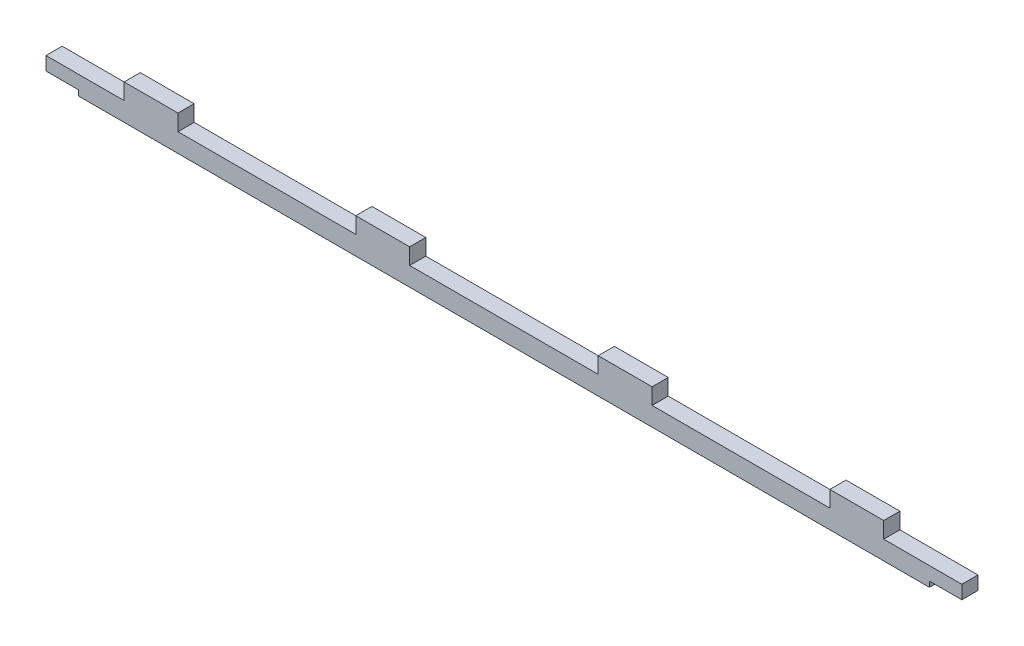
ISO-10303-21;
HEADER;
FILE_DESCRIPTION(('STEP AP214'),'2;1');
FILE_NAME('part.step','',(''),(''),'','','');
FILE_SCHEMA(('AUTOMOTIVE_DESIGN { 1 0 10303 214 1 1 1 1 }'));
ENDSEC;
DATA;
#1=APPLICATION_CONTEXT('core data for automotive mechanical design processes');
#2=APPLICATION_PROTOCOL_DEFINITION('international standard','automotive_design',2000,#1);
#3=PRODUCT_CONTEXT('',#1,'mechanical');
#4=PRODUCT('Part','Part','',(#3));
#5=PRODUCT_RELATED_PRODUCT_CATEGORY('part','',(#4));
#6=PRODUCT_DEFINITION_FORMATION('','',#4);
#7=PRODUCT_DEFINITION_CONTEXT('part definition',#1,'design');
#8=PRODUCT_DEFINITION('design','',#6,#7);
#9=PRODUCT_DEFINITION_SHAPE('','',#8);
#10=(LENGTH_UNIT() NAMED_UNIT(*) SI_UNIT(.MILLI.,.METRE.));
#11=(NAMED_UNIT(*) PLANE_ANGLE_UNIT() SI_UNIT($,.RADIAN.));
#12=(NAMED_UNIT(*) SI_UNIT($,.STERADIAN.) SOLID_ANGLE_UNIT());
#13=UNCERTAINTY_MEASURE_WITH_UNIT(LENGTH_MEASURE(1.E-05),#10,'distance_accuracy_value','');
#14=(GEOMETRIC_REPRESENTATION_CONTEXT(3) GLOBAL_UNCERTAINTY_ASSIGNED_CONTEXT((#13)) GLOBAL_UNIT_ASSIGNED_CONTEXT((#10,
#11,#12)) REPRESENTATION_CONTEXT('',''));
#15=CARTESIAN_POINT('',(0.,0.,0.));
#16=DIRECTION('',(0.,0.,1.));
#17=DIRECTION('',(1.,0.,0.));
#18=AXIS2_PLACEMENT_3D('',#15,#16,#17);
#19=CARTESIAN_POINT('',(70.5,3.50000000000002,3.));
#20=DIRECTION('',(0.,-1.,0.));
#21=DIRECTION('',(1.,0.,0.));
#22=AXIS2_PLACEMENT_3D('',#19,#20,#21);
#23=PLANE('',#22);
#24=DIRECTION('',(-1.,0.,0.));
#25=VECTOR('',#24,1.);
#26=CARTESIAN_POINT('',(70.5,3.50000000000002,0.));
#27=LINE('',#26,#25);
#28=CARTESIAN_POINT('',(85.,3.49999999999998,0.));
#29=VERTEX_POINT('',#28);
#30=CARTESIAN_POINT('',(70.5,3.50000000000002,0.));
#31=VERTEX_POINT('',#30);
#32=EDGE_CURVE('E226',#29,#31,#27,.T.);
#33=ORIENTED_EDGE('',*,*,#32,.T.);
#34=DIRECTION('',(0.,0.,-1.));
#35=VECTOR('',#34,1.);
#36=CARTESIAN_POINT('',(70.5,3.50000000000002,3.));
#37=LINE('',#36,#35);
#38=CARTESIAN_POINT('',(70.5,3.50000000000002,3.));
#39=VERTEX_POINT('',#38);
#40=EDGE_CURVE('E11',#39,#31,#37,.T.);
#41=ORIENTED_EDGE('',*,*,#40,.F.);
#42=DIRECTION('',(-1.,0.,0.));
#43=VECTOR('',#42,1.);
#44=CARTESIAN_POINT('',(70.5,3.50000000000002,3.));
#45=LINE('',#44,#43);
#46=CARTESIAN_POINT('',(85.,3.49999999999998,3.));
#47=VERTEX_POINT('',#46);
#48=EDGE_CURVE('E272',#47,#39,#45,.T.);
#49=ORIENTED_EDGE('',*,*,#48,.F.);
#50=DIRECTION('',(0.,0.,-1.));
#51=VECTOR('',#50,1.);
#52=CARTESIAN_POINT('',(85.,3.49999999999998,3.));
#53=LINE('',#52,#51);
#54=EDGE_CURVE('E222',#47,#29,#53,.T.);
#55=ORIENTED_EDGE('',*,*,#54,.T.);
#56=EDGE_LOOP('',(#33,#41,#49,#55));
#57=FACE_BOUND('',#56,.T.);
#58=ADVANCED_FACE('F34',(#57),#23,.F.);
#59=CARTESIAN_POINT('',(70.5,6.50000000000001,3.));
#60=DIRECTION('',(-1.,0.,0.));
#61=DIRECTION('',(0.,0.,1.));
#62=AXIS2_PLACEMENT_3D('',#59,#60,#61);
#63=PLANE('',#62);
#64=DIRECTION('',(0.,1.,0.));
#65=VECTOR('',#64,1.);
#66=CARTESIAN_POINT('',(70.5,6.50000000000001,0.));
#67=LINE('',#66,#65);
#68=CARTESIAN_POINT('',(70.5,6.50000000000001,0.));
#69=VERTEX_POINT('',#68);
#70=EDGE_CURVE('E229',#31,#69,#67,.T.);
#71=ORIENTED_EDGE('',*,*,#70,.T.);
#72=DIRECTION('',(0.,0.,-1.));
#73=VECTOR('',#72,1.);
#74=CARTESIAN_POINT('',(70.5,6.50000000000001,3.));
#75=LINE('',#74,#73);
#76=CARTESIAN_POINT('',(70.5,6.50000000000001,3.));
#77=VERTEX_POINT('',#76);
#78=EDGE_CURVE('E42',#77,#69,#75,.T.);
#79=ORIENTED_EDGE('',*,*,#78,.F.);
#80=DIRECTION('',(0.,1.,0.));
#81=VECTOR('',#80,1.);
#82=CARTESIAN_POINT('',(70.5,6.50000000000001,3.));
#83=LINE('',#82,#81);
#84=EDGE_CURVE('E141',#39,#77,#83,.T.);
#85=ORIENTED_EDGE('',*,*,#84,.F.);
#86=ORIENTED_EDGE('',*,*,#40,.T.);
#87=EDGE_LOOP('',(#71,#79,#85,#86));
#88=FACE_BOUND('',#87,.T.);
#89=ADVANCED_FACE('F410',(#88),#63,.F.);
#90=CARTESIAN_POINT('',(70.5,6.50000000000001,3.));
#91=DIRECTION('',(0.,-1.,0.));
#92=DIRECTION('',(1.,0.,0.));
#93=AXIS2_PLACEMENT_3D('',#90,#91,#92);
#94=PLANE('',#93);
#95=DIRECTION('',(-1.,0.,0.));
#96=VECTOR('',#95,1.);
#97=CARTESIAN_POINT('',(70.5,6.50000000000001,0.));
#98=LINE('',#97,#96);
#99=CARTESIAN_POINT('',(60.5,6.50000000000001,0.));
#100=VERTEX_POINT('',#99);
#101=EDGE_CURVE('E231',#69,#100,#98,.T.);
#102=ORIENTED_EDGE('',*,*,#101,.T.);
#103=DIRECTION('',(0.,0.,-1.));
#104=VECTOR('',#103,1.);
#105=CARTESIAN_POINT('',(60.5,6.50000000000001,3.));
#106=LINE('',#105,#104);
#107=CARTESIAN_POINT('',(60.5,6.50000000000001,3.));
#108=VERTEX_POINT('',#107);
#109=EDGE_CURVE('E327',#108,#100,#106,.T.);
#110=ORIENTED_EDGE('',*,*,#109,.F.);
#111=DIRECTION('',(-1.,0.,0.));
#112=VECTOR('',#111,1.);
#113=CARTESIAN_POINT('',(70.5,6.50000000000001,3.));
#114=LINE('',#113,#112);
#115=EDGE_CURVE('E335',#77,#108,#114,.T.);
#116=ORIENTED_EDGE('',*,*,#115,.F.);
#117=ORIENTED_EDGE('',*,*,#78,.T.);
#118=EDGE_LOOP('',(#102,#110,#116,#117));
#119=FACE_BOUND('',#118,.T.);
#120=ADVANCED_FACE('F333',(#119),#94,.F.);
#121=CARTESIAN_POINT('',(60.5,6.50000000000001,3.));
#122=DIRECTION('',(1.,0.,0.));
#123=DIRECTION('',(0.,1.,0.));
#124=AXIS2_PLACEMENT_3D('',#121,#122,#123);
#125=PLANE('',#124);
#126=DIRECTION('',(0.,-1.,0.));
#127=VECTOR('',#126,1.);
#128=CARTESIAN_POINT('',(60.5,6.50000000000001,0.));
#129=LINE('',#128,#127);
#130=CARTESIAN_POINT('',(60.5,3.50000000000002,0.));
#131=VERTEX_POINT('',#130);
#132=EDGE_CURVE('E233',#100,#131,#129,.T.);
#133=ORIENTED_EDGE('',*,*,#132,.T.);
#134=DIRECTION('',(0.,0.,-1.));
#135=VECTOR('',#134,1.);
#136=CARTESIAN_POINT('',(60.5,3.50000000000002,3.));
#137=LINE('',#136,#135);
#138=CARTESIAN_POINT('',(60.5,3.50000000000002,3.));
#139=VERTEX_POINT('',#138);
#140=EDGE_CURVE('E324',#139,#131,#137,.T.);
#141=ORIENTED_EDGE('',*,*,#140,.F.);
#142=DIRECTION('',(0.,-1.,0.));
#143=VECTOR('',#142,1.);
#144=CARTESIAN_POINT('',(60.5,6.50000000000001,3.));
#145=LINE('',#144,#143);
#146=EDGE_CURVE('E353',#108,#139,#145,.T.);
#147=ORIENTED_EDGE('',*,*,#146,.F.);
#148=ORIENTED_EDGE('',*,*,#109,.T.);
#149=EDGE_LOOP('',(#133,#141,#147,#148));
#150=FACE_BOUND('',#149,.T.);
#151=ADVANCED_FACE('F344',(#150),#125,.F.);
#152=CARTESIAN_POINT('',(27.5,3.50000000000001,3.));
#153=DIRECTION('',(0.,-1.,0.));
#154=DIRECTION('',(1.,0.,0.));
#155=AXIS2_PLACEMENT_3D('',#152,#153,#154);
#156=PLANE('',#155);
#157=DIRECTION('',(-1.,0.,0.));
#158=VECTOR('',#157,1.);
#159=CARTESIAN_POINT('',(27.5,3.50000000000001,0.));
#160=LINE('',#159,#158);
#161=CARTESIAN_POINT('',(27.5,3.50000000000001,0.));
#162=VERTEX_POINT('',#161);
#163=EDGE_CURVE('E235',#131,#162,#160,.T.);
#164=ORIENTED_EDGE('',*,*,#163,.T.);
#165=DIRECTION('',(0.,0.,-1.));
#166=VECTOR('',#165,1.);
#167=CARTESIAN_POINT('',(27.5,3.50000000000001,3.));
#168=LINE('',#167,#166);
#169=CARTESIAN_POINT('',(27.5,3.50000000000001,3.));
#170=VERTEX_POINT('',#169);
#171=EDGE_CURVE('E321',#170,#162,#168,.T.);
#172=ORIENTED_EDGE('',*,*,#171,.F.);
#173=DIRECTION('',(-1.,0.,0.));
#174=VECTOR('',#173,1.);
#175=CARTESIAN_POINT('',(27.5,3.50000000000001,3.));
#176=LINE('',#175,#174);
#177=EDGE_CURVE('E350',#139,#170,#176,.T.);
#178=ORIENTED_EDGE('',*,*,#177,.F.);
#179=ORIENTED_EDGE('',*,*,#140,.T.);
#180=EDGE_LOOP('',(#164,#172,#178,#179));
#181=FACE_BOUND('',#180,.T.);
#182=ADVANCED_FACE('F348',(#181),#156,.F.);
#183=CARTESIAN_POINT('',(27.5,6.50000000000001,3.));
#184=DIRECTION('',(-1.,0.,0.));
#185=DIRECTION('',(0.,0.,1.));
#186=AXIS2_PLACEMENT_3D('',#183,#184,#185);
#187=PLANE('',#186);
#188=DIRECTION('',(0.,1.,0.));
#189=VECTOR('',#188,1.);
#190=CARTESIAN_POINT('',(27.5,6.50000000000001,0.));
#191=LINE('',#190,#189);
#192=CARTESIAN_POINT('',(27.5,6.50000000000001,0.));
#193=VERTEX_POINT('',#192);
#194=EDGE_CURVE('E237',#162,#193,#191,.T.);
#195=ORIENTED_EDGE('',*,*,#194,.T.);
#196=DIRECTION('',(0.,0.,-1.));
#197=VECTOR('',#196,1.);
#198=CARTESIAN_POINT('',(27.5,6.50000000000001,3.));
#199=LINE('',#198,#197);
#200=CARTESIAN_POINT('',(27.5,6.50000000000001,3.));
#201=VERTEX_POINT('',#200);
#202=EDGE_CURVE('E318',#201,#193,#199,.T.);
#203=ORIENTED_EDGE('',*,*,#202,.F.);
#204=DIRECTION('',(0.,1.,0.));
#205=VECTOR('',#204,1.);
#206=CARTESIAN_POINT('',(27.5,6.50000000000001,3.));
#207=LINE('',#206,#205);
#208=EDGE_CURVE('E352',#170,#201,#207,.T.);
#209=ORIENTED_EDGE('',*,*,#208,.F.);
#210=ORIENTED_EDGE('',*,*,#171,.T.);
#211=EDGE_LOOP('',(#195,#203,#209,#210));
#212=FACE_BOUND('',#211,.T.);
#213=ADVANCED_FACE('F423',(#212),#187,.F.);
#214=CARTESIAN_POINT('',(27.5,6.50000000000001,3.));
#215=DIRECTION('',(0.,-1.,0.));
#216=DIRECTION('',(0.,0.,-1.));
#217=AXIS2_PLACEMENT_3D('',#214,#215,#216);
#218=PLANE('',#217);
#219=DIRECTION('',(-1.,0.,0.));
#220=VECTOR('',#219,1.);
#221=CARTESIAN_POINT('',(27.5,6.50000000000001,0.));
#222=LINE('',#221,#220);
#223=CARTESIAN_POINT('',(17.5,6.50000000000001,0.));
#224=VERTEX_POINT('',#223);
#225=EDGE_CURVE('E239',#193,#224,#222,.T.);
#226=ORIENTED_EDGE('',*,*,#225,.T.);
#227=DIRECTION('',(0.,0.,-1.));
#228=VECTOR('',#227,1.);
#229=CARTESIAN_POINT('',(17.5,6.50000000000001,3.));
#230=LINE('',#229,#228);
#231=CARTESIAN_POINT('',(17.5,6.50000000000001,3.));
#232=VERTEX_POINT('',#231);
#233=EDGE_CURVE('E315',#232,#224,#230,.T.);
#234=ORIENTED_EDGE('',*,*,#233,.F.);
#235=DIRECTION('',(-1.,0.,0.));
#236=VECTOR('',#235,1.);
#237=CARTESIAN_POINT('',(27.5,6.50000000000001,3.));
#238=LINE('',#237,#236);
#239=EDGE_CURVE('E355',#201,#232,#238,.T.);
#240=ORIENTED_EDGE('',*,*,#239,.F.);
#241=ORIENTED_EDGE('',*,*,#202,.T.);
#242=EDGE_LOOP('',(#226,#234,#240,#241));
#243=FACE_BOUND('',#242,.T.);
#244=ADVANCED_FACE('F426',(#243),#218,.F.);
#245=CARTESIAN_POINT('',(17.5,6.50000000000001,3.));
#246=DIRECTION('',(1.,0.,0.));
#247=DIRECTION('',(0.,1.,0.));
#248=AXIS2_PLACEMENT_3D('',#245,#246,#247);
#249=PLANE('',#248);
#250=DIRECTION('',(0.,-1.,0.));
#251=VECTOR('',#250,1.);
#252=CARTESIAN_POINT('',(17.5,6.50000000000001,0.));
#253=LINE('',#252,#251);
#254=CARTESIAN_POINT('',(17.5,3.50000000000001,0.));
#255=VERTEX_POINT('',#254);
#256=EDGE_CURVE('E241',#224,#255,#253,.T.);
#257=ORIENTED_EDGE('',*,*,#256,.T.);
#258=DIRECTION('',(0.,0.,-1.));
#259=VECTOR('',#258,1.);
#260=CARTESIAN_POINT('',(17.5,3.50000000000001,3.));
#261=LINE('',#260,#259);
#262=CARTESIAN_POINT('',(17.5,3.50000000000001,3.));
#263=VERTEX_POINT('',#262);
#264=EDGE_CURVE('E312',#263,#255,#261,.T.);
#265=ORIENTED_EDGE('',*,*,#264,.F.);
#266=DIRECTION('',(0.,-1.,0.));
#267=VECTOR('',#266,1.);
#268=CARTESIAN_POINT('',(17.5,6.50000000000001,3.));
#269=LINE('',#268,#267);
#270=EDGE_CURVE('E361',#232,#263,#269,.T.);
#271=ORIENTED_EDGE('',*,*,#270,.F.);
#272=ORIENTED_EDGE('',*,*,#233,.T.);
#273=EDGE_LOOP('',(#257,#265,#271,#272));
#274=FACE_BOUND('',#273,.T.);
#275=ADVANCED_FACE('F430',(#274),#249,.F.);
#276=CARTESIAN_POINT('',(-17.5,3.50000000000001,3.));
#277=DIRECTION('',(0.,-1.,0.));
#278=DIRECTION('',(1.,0.,0.));
#279=AXIS2_PLACEMENT_3D('',#276,#277,#278);
#280=PLANE('',#279);
#281=DIRECTION('',(-1.,0.,0.));
#282=VECTOR('',#281,1.);
#283=CARTESIAN_POINT('',(-17.5,3.50000000000001,0.));
#284=LINE('',#283,#282);
#285=CARTESIAN_POINT('',(-17.5,3.50000000000001,0.));
#286=VERTEX_POINT('',#285);
#287=EDGE_CURVE('E243',#255,#286,#284,.T.);
#288=ORIENTED_EDGE('',*,*,#287,.T.);
#289=DIRECTION('',(0.,0.,-1.));
#290=VECTOR('',#289,1.);
#291=CARTESIAN_POINT('',(-17.5,3.50000000000001,3.));
#292=LINE('',#291,#290);
#293=CARTESIAN_POINT('',(-17.5,3.50000000000001,3.));
#294=VERTEX_POINT('',#293);
#295=EDGE_CURVE('E309',#294,#286,#292,.T.);
#296=ORIENTED_EDGE('',*,*,#295,.F.);
#297=DIRECTION('',(-1.,0.,0.));
#298=VECTOR('',#297,1.);
#299=CARTESIAN_POINT('',(-17.5,3.50000000000001,3.));
#300=LINE('',#299,#298);
#301=EDGE_CURVE('E363',#263,#294,#300,.T.);
#302=ORIENTED_EDGE('',*,*,#301,.F.);
#303=ORIENTED_EDGE('',*,*,#264,.T.);
#304=EDGE_LOOP('',(#288,#296,#302,#303));
#305=FACE_BOUND('',#304,.T.);
#306=ADVANCED_FACE('F434',(#305),#280,.F.);
#307=CARTESIAN_POINT('',(-17.5,6.5,3.));
#308=DIRECTION('',(-1.,0.,0.));
#309=DIRECTION('',(0.,-1.,0.));
#310=AXIS2_PLACEMENT_3D('',#307,#308,#309);
#311=PLANE('',#310);
#312=DIRECTION('',(0.,1.,0.));
#313=VECTOR('',#312,1.);
#314=CARTESIAN_POINT('',(-17.5,6.5,0.));
#315=LINE('',#314,#313);
#316=CARTESIAN_POINT('',(-17.5,6.5,0.));
#317=VERTEX_POINT('',#316);
#318=EDGE_CURVE('E245',#286,#317,#315,.T.);
#319=ORIENTED_EDGE('',*,*,#318,.T.);
#320=DIRECTION('',(0.,0.,-1.));
#321=VECTOR('',#320,1.);
#322=CARTESIAN_POINT('',(-17.5,6.5,3.));
#323=LINE('',#322,#321);
#324=CARTESIAN_POINT('',(-17.5,6.5,3.));
#325=VERTEX_POINT('',#324);
#326=EDGE_CURVE('E306',#325,#317,#323,.T.);
#327=ORIENTED_EDGE('',*,*,#326,.F.);
#328=DIRECTION('',(0.,1.,0.));
#329=VECTOR('',#328,1.);
#330=CARTESIAN_POINT('',(-17.5,6.5,3.));
#331=LINE('',#330,#329);
#332=EDGE_CURVE('E365',#294,#325,#331,.T.);
#333=ORIENTED_EDGE('',*,*,#332,.F.);
#334=ORIENTED_EDGE('',*,*,#295,.T.);
#335=EDGE_LOOP('',(#319,#327,#333,#334));
#336=FACE_BOUND('',#335,.T.);
#337=ADVANCED_FACE('F438',(#336),#311,.F.);
#338=CARTESIAN_POINT('',(-27.5,6.5,3.));
#339=DIRECTION('',(0.,-1.,0.));
#340=DIRECTION('',(1.,0.,0.));
#341=AXIS2_PLACEMENT_3D('',#338,#339,#340);
#342=PLANE('',#341);
#343=DIRECTION('',(-1.,0.,0.));
#344=VECTOR('',#343,1.);
#345=CARTESIAN_POINT('',(-27.5,6.5,0.));
#346=LINE('',#345,#344);
#347=CARTESIAN_POINT('',(-27.5,6.5,0.));
#348=VERTEX_POINT('',#347);
#349=EDGE_CURVE('E247',#317,#348,#346,.T.);
#350=ORIENTED_EDGE('',*,*,#349,.T.);
#351=DIRECTION('',(0.,0.,-1.));
#352=VECTOR('',#351,1.);
#353=CARTESIAN_POINT('',(-27.5,6.5,3.));
#354=LINE('',#353,#352);
#355=CARTESIAN_POINT('',(-27.5,6.5,3.));
#356=VERTEX_POINT('',#355);
#357=EDGE_CURVE('E303',#356,#348,#354,.T.);
#358=ORIENTED_EDGE('',*,*,#357,.F.);
#359=DIRECTION('',(-1.,0.,0.));
#360=VECTOR('',#359,1.);
#361=CARTESIAN_POINT('',(-27.5,6.5,3.));
#362=LINE('',#361,#360);
#363=EDGE_CURVE('E367',#325,#356,#362,.T.);
#364=ORIENTED_EDGE('',*,*,#363,.F.);
#365=ORIENTED_EDGE('',*,*,#326,.T.);
#366=EDGE_LOOP('',(#350,#358,#364,#365));
#367=FACE_BOUND('',#366,.T.);
#368=ADVANCED_FACE('F442',(#367),#342,.F.);
#369=CARTESIAN_POINT('',(-27.5,6.5,3.));
#370=DIRECTION('',(1.,0.,0.));
#371=DIRECTION('',(0.,0.,-1.));
#372=AXIS2_PLACEMENT_3D('',#369,#370,#371);
#373=PLANE('',#372);
#374=DIRECTION('',(0.,-1.,0.));
#375=VECTOR('',#374,1.);
#376=CARTESIAN_POINT('',(-27.5,6.5,0.));
#377=LINE('',#376,#375);
#378=CARTESIAN_POINT('',(-27.5,3.5,0.));
#379=VERTEX_POINT('',#378);
#380=EDGE_CURVE('E249',#348,#379,#377,.T.);
#381=ORIENTED_EDGE('',*,*,#380,.T.);
#382=DIRECTION('',(0.,0.,-1.));
#383=VECTOR('',#382,1.);
#384=CARTESIAN_POINT('',(-27.5,3.5,3.));
#385=LINE('',#384,#383);
#386=CARTESIAN_POINT('',(-27.5,3.5,3.));
#387=VERTEX_POINT('',#386);
#388=EDGE_CURVE('E300',#387,#379,#385,.T.);
#389=ORIENTED_EDGE('',*,*,#388,.F.);
#390=DIRECTION('',(0.,-1.,0.));
#391=VECTOR('',#390,1.);
#392=CARTESIAN_POINT('',(-27.5,6.5,3.));
#393=LINE('',#392,#391);
#394=EDGE_CURVE('E369',#356,#387,#393,.T.);
#395=ORIENTED_EDGE('',*,*,#394,.F.);
#396=ORIENTED_EDGE('',*,*,#357,.T.);
#397=EDGE_LOOP('',(#381,#389,#395,#396));
#398=FACE_BOUND('',#397,.T.);
#399=ADVANCED_FACE('F446',(#398),#373,.F.);
#400=CARTESIAN_POINT('',(-60.5,3.5,3.));
#401=DIRECTION('',(0.,-1.,0.));
#402=DIRECTION('',(0.,0.,-1.));
#403=AXIS2_PLACEMENT_3D('',#400,#401,#402);
#404=PLANE('',#403);
#405=DIRECTION('',(-1.,0.,0.));
#406=VECTOR('',#405,1.);
#407=CARTESIAN_POINT('',(-60.5,3.5,0.));
#408=LINE('',#407,#406);
#409=CARTESIAN_POINT('',(-60.5,3.5,0.));
#410=VERTEX_POINT('',#409);
#411=EDGE_CURVE('E251',#379,#410,#408,.T.);
#412=ORIENTED_EDGE('',*,*,#411,.T.);
#413=DIRECTION('',(0.,0.,-1.));
#414=VECTOR('',#413,1.);
#415=CARTESIAN_POINT('',(-60.5,3.5,3.));
#416=LINE('',#415,#414);
#417=CARTESIAN_POINT('',(-60.5,3.5,3.));
#418=VERTEX_POINT('',#417);
#419=EDGE_CURVE('E297',#418,#410,#416,.T.);
#420=ORIENTED_EDGE('',*,*,#419,.F.);
#421=DIRECTION('',(-1.,0.,0.));
#422=VECTOR('',#421,1.);
#423=CARTESIAN_POINT('',(-60.5,3.5,3.));
#424=LINE('',#423,#422);
#425=EDGE_CURVE('E371',#387,#418,#424,.T.);
#426=ORIENTED_EDGE('',*,*,#425,.F.);
#427=ORIENTED_EDGE('',*,*,#388,.T.);
#428=EDGE_LOOP('',(#412,#420,#426,#427));
#429=FACE_BOUND('',#428,.T.);
#430=ADVANCED_FACE('F450',(#429),#404,.F.);
#431=CARTESIAN_POINT('',(-60.5,6.49999999999999,3.));
#432=DIRECTION('',(-1.,0.,0.));
#433=DIRECTION('',(0.,-1.,0.));
#434=AXIS2_PLACEMENT_3D('',#431,#432,#433);
#435=PLANE('',#434);
#436=DIRECTION('',(0.,1.,0.));
#437=VECTOR('',#436,1.);
#438=CARTESIAN_POINT('',(-60.5,6.49999999999999,0.));
#439=LINE('',#438,#437);
#440=CARTESIAN_POINT('',(-60.5,6.49999999999999,0.));
#441=VERTEX_POINT('',#440);
#442=EDGE_CURVE('E253',#410,#441,#439,.T.);
#443=ORIENTED_EDGE('',*,*,#442,.T.);
#444=DIRECTION('',(0.,0.,-1.));
#445=VECTOR('',#444,1.);
#446=CARTESIAN_POINT('',(-60.5,6.49999999999999,3.));
#447=LINE('',#446,#445);
#448=CARTESIAN_POINT('',(-60.5,6.49999999999999,3.));
#449=VERTEX_POINT('',#448);
#450=EDGE_CURVE('E294',#449,#441,#447,.T.);
#451=ORIENTED_EDGE('',*,*,#450,.F.);
#452=DIRECTION('',(0.,1.,0.));
#453=VECTOR('',#452,1.);
#454=CARTESIAN_POINT('',(-60.5,6.49999999999999,3.));
#455=LINE('',#454,#453);
#456=EDGE_CURVE('E373',#418,#449,#455,.T.);
#457=ORIENTED_EDGE('',*,*,#456,.F.);
#458=ORIENTED_EDGE('',*,*,#419,.T.);
#459=EDGE_LOOP('',(#443,#451,#457,#458));
#460=FACE_BOUND('',#459,.T.);
#461=ADVANCED_FACE('F454',(#460),#435,.F.);
#462=CARTESIAN_POINT('',(-70.5,6.49999999999999,3.));
#463=DIRECTION('',(0.,-1.,0.));
#464=DIRECTION('',(1.,0.,0.));
#465=AXIS2_PLACEMENT_3D('',#462,#463,#464);
#466=PLANE('',#465);
#467=DIRECTION('',(-1.,0.,0.));
#468=VECTOR('',#467,1.);
#469=CARTESIAN_POINT('',(-70.5,6.49999999999999,0.));
#470=LINE('',#469,#468);
#471=CARTESIAN_POINT('',(-70.5,6.49999999999999,0.));
#472=VERTEX_POINT('',#471);
#473=EDGE_CURVE('E255',#441,#472,#470,.T.);
#474=ORIENTED_EDGE('',*,*,#473,.T.);
#475=DIRECTION('',(0.,0.,-1.));
#476=VECTOR('',#475,1.);
#477=CARTESIAN_POINT('',(-70.5,6.49999999999999,3.));
#478=LINE('',#477,#476);
#479=CARTESIAN_POINT('',(-70.5,6.49999999999999,3.));
#480=VERTEX_POINT('',#479);
#481=EDGE_CURVE('E291',#480,#472,#478,.T.);
#482=ORIENTED_EDGE('',*,*,#481,.F.);
#483=DIRECTION('',(-1.,0.,0.));
#484=VECTOR('',#483,1.);
#485=CARTESIAN_POINT('',(-70.5,6.49999999999999,3.));
#486=LINE('',#485,#484);
#487=EDGE_CURVE('E375',#449,#480,#486,.T.);
#488=ORIENTED_EDGE('',*,*,#487,.F.);
#489=ORIENTED_EDGE('',*,*,#450,.T.);
#490=EDGE_LOOP('',(#474,#482,#488,#489));
#491=FACE_BOUND('',#490,.T.);
#492=ADVANCED_FACE('F458',(#491),#466,.F.);
#493=CARTESIAN_POINT('',(-70.5,6.49999999999999,3.));
#494=DIRECTION('',(1.,0.,0.));
#495=DIRECTION('',(0.,0.,-1.));
#496=AXIS2_PLACEMENT_3D('',#493,#494,#495);
#497=PLANE('',#496);
#498=DIRECTION('',(0.,-1.,0.));
#499=VECTOR('',#498,1.);
#500=CARTESIAN_POINT('',(-70.5,6.49999999999999,0.));
#501=LINE('',#500,#499);
#502=CARTESIAN_POINT('',(-70.5,3.5,0.));
#503=VERTEX_POINT('',#502);
#504=EDGE_CURVE('E257',#472,#503,#501,.T.);
#505=ORIENTED_EDGE('',*,*,#504,.T.);
#506=DIRECTION('',(0.,0.,-1.));
#507=VECTOR('',#506,1.);
#508=CARTESIAN_POINT('',(-70.5,3.5,3.));
#509=LINE('',#508,#507);
#510=CARTESIAN_POINT('',(-70.5,3.5,3.));
#511=VERTEX_POINT('',#510);
#512=EDGE_CURVE('E288',#511,#503,#509,.T.);
#513=ORIENTED_EDGE('',*,*,#512,.F.);
#514=DIRECTION('',(0.,-1.,0.));
#515=VECTOR('',#514,1.);
#516=CARTESIAN_POINT('',(-70.5,6.49999999999999,3.));
#517=LINE('',#516,#515);
#518=EDGE_CURVE('E377',#480,#511,#517,.T.);
#519=ORIENTED_EDGE('',*,*,#518,.F.);
#520=ORIENTED_EDGE('',*,*,#481,.T.);
#521=EDGE_LOOP('',(#505,#513,#519,#520));
#522=FACE_BOUND('',#521,.T.);
#523=ADVANCED_FACE('F462',(#522),#497,.F.);
#524=CARTESIAN_POINT('',(-85.,3.5,3.));
#525=DIRECTION('',(0.,-1.,0.));
#526=DIRECTION('',(1.,0.,0.));
#527=AXIS2_PLACEMENT_3D('',#524,#525,#526);
#528=PLANE('',#527);
#529=DIRECTION('',(-1.,0.,0.));
#530=VECTOR('',#529,1.);
#531=CARTESIAN_POINT('',(-85.,3.5,0.));
#532=LINE('',#531,#530);
#533=CARTESIAN_POINT('',(-85.,3.5,0.));
#534=VERTEX_POINT('',#533);
#535=EDGE_CURVE('E259',#503,#534,#532,.T.);
#536=ORIENTED_EDGE('',*,*,#535,.T.);
#537=DIRECTION('',(0.,0.,-1.));
#538=VECTOR('',#537,1.);
#539=CARTESIAN_POINT('',(-85.,3.5,3.));
#540=LINE('',#539,#538);
#541=CARTESIAN_POINT('',(-85.,3.5,3.));
#542=VERTEX_POINT('',#541);
#543=EDGE_CURVE('E285',#542,#534,#540,.T.);
#544=ORIENTED_EDGE('',*,*,#543,.F.);
#545=DIRECTION('',(-1.,0.,0.));
#546=VECTOR('',#545,1.);
#547=CARTESIAN_POINT('',(-85.,3.5,3.));
#548=LINE('',#547,#546);
#549=EDGE_CURVE('E379',#511,#542,#548,.T.);
#550=ORIENTED_EDGE('',*,*,#549,.F.);
#551=ORIENTED_EDGE('',*,*,#512,.T.);
#552=EDGE_LOOP('',(#536,#544,#550,#551));
#553=FACE_BOUND('',#552,.T.);
#554=ADVANCED_FACE('F466',(#553),#528,.F.);
#555=CARTESIAN_POINT('',(-85.,1.,3.));
#556=DIRECTION('',(1.,0.,0.));
#557=DIRECTION('',(0.,0.,-1.));
#558=AXIS2_PLACEMENT_3D('',#555,#556,#557);
#559=PLANE('',#558);
#560=DIRECTION('',(0.,-1.,0.));
#561=VECTOR('',#560,1.);
#562=CARTESIAN_POINT('',(-85.,1.,0.));
#563=LINE('',#562,#561);
#564=CARTESIAN_POINT('',(-85.,1.,0.));
#565=VERTEX_POINT('',#564);
#566=EDGE_CURVE('E261',#534,#565,#563,.T.);
#567=ORIENTED_EDGE('',*,*,#566,.T.);
#568=DIRECTION('',(0.,0.,-1.));
#569=VECTOR('',#568,1.);
#570=CARTESIAN_POINT('',(-85.,1.,3.));
#571=LINE('',#570,#569);
#572=CARTESIAN_POINT('',(-85.,1.,3.));
#573=VERTEX_POINT('',#572);
#574=EDGE_CURVE('E282',#573,#565,#571,.T.);
#575=ORIENTED_EDGE('',*,*,#574,.F.);
#576=DIRECTION('',(0.,-1.,0.));
#577=VECTOR('',#576,1.);
#578=CARTESIAN_POINT('',(-85.,1.,3.));
#579=LINE('',#578,#577);
#580=EDGE_CURVE('E381',#542,#573,#579,.T.);
#581=ORIENTED_EDGE('',*,*,#580,.F.);
#582=ORIENTED_EDGE('',*,*,#543,.T.);
#583=EDGE_LOOP('',(#567,#575,#581,#582));
#584=FACE_BOUND('',#583,.T.);
#585=ADVANCED_FACE('F470',(#584),#559,.F.);
#586=CARTESIAN_POINT('',(-85.,1.,3.));
#587=DIRECTION('',(0.,1.,0.));
#588=DIRECTION('',(0.,0.,1.));
#589=AXIS2_PLACEMENT_3D('',#586,#587,#588);
#590=PLANE('',#589);
#591=DIRECTION('',(1.,0.,0.));
#592=VECTOR('',#591,1.);
#593=CARTESIAN_POINT('',(-85.,1.,0.));
#594=LINE('',#593,#592);
#595=CARTESIAN_POINT('',(-79.,1.,0.));
#596=VERTEX_POINT('',#595);
#597=EDGE_CURVE('E263',#565,#596,#594,.T.);
#598=ORIENTED_EDGE('',*,*,#597,.T.);
#599=DIRECTION('',(0.,0.,-1.));
#600=VECTOR('',#599,1.);
#601=CARTESIAN_POINT('',(-79.,1.,3.));
#602=LINE('',#601,#600);
#603=CARTESIAN_POINT('',(-79.,1.,3.));
#604=VERTEX_POINT('',#603);
#605=EDGE_CURVE('E279',#604,#596,#602,.T.);
#606=ORIENTED_EDGE('',*,*,#605,.F.);
#607=DIRECTION('',(1.,0.,0.));
#608=VECTOR('',#607,1.);
#609=CARTESIAN_POINT('',(-85.,1.,3.));
#610=LINE('',#609,#608);
#611=EDGE_CURVE('E383',#573,#604,#610,.T.);
#612=ORIENTED_EDGE('',*,*,#611,.F.);
#613=ORIENTED_EDGE('',*,*,#574,.T.);
#614=EDGE_LOOP('',(#598,#606,#612,#613));
#615=FACE_BOUND('',#614,.T.);
#616=ADVANCED_FACE('F474',(#615),#590,.F.);
#617=CARTESIAN_POINT('',(-79.,1.,3.));
#618=DIRECTION('',(1.,0.,0.));
#619=DIRECTION('',(0.,0.,-1.));
#620=AXIS2_PLACEMENT_3D('',#617,#618,#619);
#621=PLANE('',#620);
#622=DIRECTION('',(0.,-1.,0.));
#623=VECTOR('',#622,1.);
#624=CARTESIAN_POINT('',(-79.,1.,0.));
#625=LINE('',#624,#623);
#626=CARTESIAN_POINT('',(-79.,0.,0.));
#627=VERTEX_POINT('',#626);
#628=EDGE_CURVE('E265',#596,#627,#625,.T.);
#629=ORIENTED_EDGE('',*,*,#628,.T.);
#630=DIRECTION('',(0.,0.,-1.));
#631=VECTOR('',#630,1.);
#632=CARTESIAN_POINT('',(-79.,0.,3.));
#633=LINE('',#632,#631);
#634=CARTESIAN_POINT('',(-79.,0.,3.));
#635=VERTEX_POINT('',#634);
#636=EDGE_CURVE('E276',#635,#627,#633,.T.);
#637=ORIENTED_EDGE('',*,*,#636,.F.);
#638=DIRECTION('',(0.,-1.,0.));
#639=VECTOR('',#638,1.);
#640=CARTESIAN_POINT('',(-79.,1.,3.));
#641=LINE('',#640,#639);
#642=EDGE_CURVE('E385',#604,#635,#641,.T.);
#643=ORIENTED_EDGE('',*,*,#642,.F.);
#644=ORIENTED_EDGE('',*,*,#605,.T.);
#645=EDGE_LOOP('',(#629,#637,#643,#644));
#646=FACE_BOUND('',#645,.T.);
#647=ADVANCED_FACE('F391',(#646),#621,.F.);
#648=CARTESIAN_POINT('',(-79.,0.,3.));
#649=DIRECTION('',(0.,1.,0.));
#650=DIRECTION('',(-1.,0.,0.));
#651=AXIS2_PLACEMENT_3D('',#648,#649,#650);
#652=PLANE('',#651);
#653=DIRECTION('',(1.,0.,0.));
#654=VECTOR('',#653,1.);
#655=CARTESIAN_POINT('',(-79.,0.,0.));
#656=LINE('',#655,#654);
#657=CARTESIAN_POINT('',(79.,0.,0.));
#658=VERTEX_POINT('',#657);
#659=EDGE_CURVE('E267',#627,#658,#656,.T.);
#660=ORIENTED_EDGE('',*,*,#659,.T.);
#661=DIRECTION('',(0.,0.,-1.));
#662=VECTOR('',#661,1.);
#663=CARTESIAN_POINT('',(79.,0.,3.));
#664=LINE('',#663,#662);
#665=CARTESIAN_POINT('',(79.,0.,3.));
#666=VERTEX_POINT('',#665);
#667=EDGE_CURVE('E217',#666,#658,#664,.T.);
#668=ORIENTED_EDGE('',*,*,#667,.F.);
#669=DIRECTION('',(1.,0.,0.));
#670=VECTOR('',#669,1.);
#671=CARTESIAN_POINT('',(-79.,0.,3.));
#672=LINE('',#671,#670);
#673=EDGE_CURVE('E208',#635,#666,#672,.T.);
#674=ORIENTED_EDGE('',*,*,#673,.F.);
#675=ORIENTED_EDGE('',*,*,#636,.T.);
#676=EDGE_LOOP('',(#660,#668,#674,#675));
#677=FACE_BOUND('',#676,.T.);
#678=ADVANCED_FACE('F395',(#677),#652,.F.);
#679=CARTESIAN_POINT('',(79.,1.00000000000002,3.));
#680=DIRECTION('',(-1.,0.,0.));
#681=DIRECTION('',(0.,0.,1.));
#682=AXIS2_PLACEMENT_3D('',#679,#680,#681);
#683=PLANE('',#682);
#684=DIRECTION('',(0.,1.,0.));
#685=VECTOR('',#684,1.);
#686=CARTESIAN_POINT('',(79.,1.00000000000002,0.));
#687=LINE('',#686,#685);
#688=CARTESIAN_POINT('',(79.,1.00000000000002,0.));
#689=VERTEX_POINT('',#688);
#690=EDGE_CURVE('E216',#658,#689,#687,.T.);
#691=ORIENTED_EDGE('',*,*,#690,.T.);
#692=DIRECTION('',(0.,0.,-1.));
#693=VECTOR('',#692,1.);
#694=CARTESIAN_POINT('',(79.,1.00000000000002,3.));
#695=LINE('',#694,#693);
#696=CARTESIAN_POINT('',(79.,1.00000000000002,3.));
#697=VERTEX_POINT('',#696);
#698=EDGE_CURVE('E213',#697,#689,#695,.T.);
#699=ORIENTED_EDGE('',*,*,#698,.F.);
#700=DIRECTION('',(0.,1.,0.));
#701=VECTOR('',#700,1.);
#702=CARTESIAN_POINT('',(79.,1.00000000000002,3.));
#703=LINE('',#702,#701);
#704=EDGE_CURVE('E202',#666,#697,#703,.T.);
#705=ORIENTED_EDGE('',*,*,#704,.F.);
#706=ORIENTED_EDGE('',*,*,#667,.T.);
#707=EDGE_LOOP('',(#691,#699,#705,#706));
#708=FACE_BOUND('',#707,.T.);
#709=ADVANCED_FACE('F214',(#708),#683,.F.);
#710=CARTESIAN_POINT('',(85.,1.00000000000002,3.));
#711=DIRECTION('',(0.,1.,0.));
#712=DIRECTION('',(-1.,0.,0.));
#713=AXIS2_PLACEMENT_3D('',#710,#711,#712);
#714=PLANE('',#713);
#715=DIRECTION('',(1.,0.,0.));
#716=VECTOR('',#715,1.);
#717=CARTESIAN_POINT('',(85.,1.00000000000002,0.));
#718=LINE('',#717,#716);
#719=CARTESIAN_POINT('',(85.,1.00000000000002,0.));
#720=VERTEX_POINT('',#719);
#721=EDGE_CURVE('E127',#689,#720,#718,.T.);
#722=ORIENTED_EDGE('',*,*,#721,.T.);
#723=DIRECTION('',(0.,0.,-1.));
#724=VECTOR('',#723,1.);
#725=CARTESIAN_POINT('',(85.,1.00000000000002,3.));
#726=LINE('',#725,#724);
#727=CARTESIAN_POINT('',(85.,1.00000000000002,3.));
#728=VERTEX_POINT('',#727);
#729=EDGE_CURVE('E218',#728,#720,#726,.T.);
#730=ORIENTED_EDGE('',*,*,#729,.F.);
#731=DIRECTION('',(1.,0.,0.));
#732=VECTOR('',#731,1.);
#733=CARTESIAN_POINT('',(85.,1.00000000000002,3.));
#734=LINE('',#733,#732);
#735=EDGE_CURVE('E206',#697,#728,#734,.T.);
#736=ORIENTED_EDGE('',*,*,#735,.F.);
#737=ORIENTED_EDGE('',*,*,#698,.T.);
#738=EDGE_LOOP('',(#722,#730,#736,#737));
#739=FACE_BOUND('',#738,.T.);
#740=ADVANCED_FACE('F220',(#739),#714,.F.);
#741=CARTESIAN_POINT('',(85.,1.00000000000002,3.));
#742=DIRECTION('',(-1.,0.,0.));
#743=DIRECTION('',(0.,-1.,0.));
#744=AXIS2_PLACEMENT_3D('',#741,#742,#743);
#745=PLANE('',#744);
#746=DIRECTION('',(0.,1.,0.));
#747=VECTOR('',#746,1.);
#748=CARTESIAN_POINT('',(85.,1.00000000000002,0.));
#749=LINE('',#748,#747);
#750=EDGE_CURVE('E133',#720,#29,#749,.T.);
#751=ORIENTED_EDGE('',*,*,#750,.T.);
#752=ORIENTED_EDGE('',*,*,#54,.F.);
#753=DIRECTION('',(0.,1.,0.));
#754=VECTOR('',#753,1.);
#755=CARTESIAN_POINT('',(85.,1.00000000000002,3.));
#756=LINE('',#755,#754);
#757=EDGE_CURVE('E50',#728,#47,#756,.T.);
#758=ORIENTED_EDGE('',*,*,#757,.F.);
#759=ORIENTED_EDGE('',*,*,#729,.T.);
#760=EDGE_LOOP('',(#751,#752,#758,#759));
#761=FACE_BOUND('',#760,.T.);
#762=ADVANCED_FACE('F399',(#761),#745,.F.);
#763=CARTESIAN_POINT('',(0.,0.,3.));
#764=DIRECTION('',(0.,0.,1.));
#765=DIRECTION('',(1.,0.,0.));
#766=AXIS2_PLACEMENT_3D('',#763,#764,#765);
#767=PLANE('',#766);
#768=ORIENTED_EDGE('',*,*,#48,.T.);
#769=ORIENTED_EDGE('',*,*,#84,.T.);
#770=ORIENTED_EDGE('',*,*,#115,.T.);
#771=ORIENTED_EDGE('',*,*,#146,.T.);
#772=ORIENTED_EDGE('',*,*,#177,.T.);
#773=ORIENTED_EDGE('',*,*,#208,.T.);
#774=ORIENTED_EDGE('',*,*,#239,.T.);
#775=ORIENTED_EDGE('',*,*,#270,.T.);
#776=ORIENTED_EDGE('',*,*,#301,.T.);
#777=ORIENTED_EDGE('',*,*,#332,.T.);
#778=ORIENTED_EDGE('',*,*,#363,.T.);
#779=ORIENTED_EDGE('',*,*,#394,.T.);
#780=ORIENTED_EDGE('',*,*,#425,.T.);
#781=ORIENTED_EDGE('',*,*,#456,.T.);
#782=ORIENTED_EDGE('',*,*,#487,.T.);
#783=ORIENTED_EDGE('',*,*,#518,.T.);
#784=ORIENTED_EDGE('',*,*,#549,.T.);
#785=ORIENTED_EDGE('',*,*,#580,.T.);
#786=ORIENTED_EDGE('',*,*,#611,.T.);
#787=ORIENTED_EDGE('',*,*,#642,.T.);
#788=ORIENTED_EDGE('',*,*,#673,.T.);
#789=ORIENTED_EDGE('',*,*,#704,.T.);
#790=ORIENTED_EDGE('',*,*,#735,.T.);
#791=ORIENTED_EDGE('',*,*,#757,.T.);
#792=EDGE_LOOP('',(#768,#769,#770,#771,#772,#773,#774,#775,#776,#777,#778,#779,#780,#781,#782,
#783,#784,#785,#786,#787,#788,#789,#790,#791));
#793=FACE_BOUND('',#792,.T.);
#794=ADVANCED_FACE('F204',(#793),#767,.T.);
#795=CARTESIAN_POINT('',(0.,0.,0.));
#796=DIRECTION('',(0.,0.,1.));
#797=DIRECTION('',(1.,0.,0.));
#798=AXIS2_PLACEMENT_3D('',#795,#796,#797);
#799=PLANE('',#798);
#800=ORIENTED_EDGE('',*,*,#32,.F.);
#801=ORIENTED_EDGE('',*,*,#750,.F.);
#802=ORIENTED_EDGE('',*,*,#721,.F.);
#803=ORIENTED_EDGE('',*,*,#690,.F.);
#804=ORIENTED_EDGE('',*,*,#659,.F.);
#805=ORIENTED_EDGE('',*,*,#628,.F.);
#806=ORIENTED_EDGE('',*,*,#597,.F.);
#807=ORIENTED_EDGE('',*,*,#566,.F.);
#808=ORIENTED_EDGE('',*,*,#535,.F.);
#809=ORIENTED_EDGE('',*,*,#504,.F.);
#810=ORIENTED_EDGE('',*,*,#473,.F.);
#811=ORIENTED_EDGE('',*,*,#442,.F.);
#812=ORIENTED_EDGE('',*,*,#411,.F.);
#813=ORIENTED_EDGE('',*,*,#380,.F.);
#814=ORIENTED_EDGE('',*,*,#349,.F.);
#815=ORIENTED_EDGE('',*,*,#318,.F.);
#816=ORIENTED_EDGE('',*,*,#287,.F.);
#817=ORIENTED_EDGE('',*,*,#256,.F.);
#818=ORIENTED_EDGE('',*,*,#225,.F.);
#819=ORIENTED_EDGE('',*,*,#194,.F.);
#820=ORIENTED_EDGE('',*,*,#163,.F.);
#821=ORIENTED_EDGE('',*,*,#132,.F.);
#822=ORIENTED_EDGE('',*,*,#101,.F.);
#823=ORIENTED_EDGE('',*,*,#70,.F.);
#824=EDGE_LOOP('',(#800,#801,#802,#803,#804,#805,#806,#807,#808,#809,#810,#811,#812,#813,#814,
#815,#816,#817,#818,#819,#820,#821,#822,#823));
#825=FACE_BOUND('',#824,.T.);
#826=ADVANCED_FACE('F339',(#825),#799,.F.);
#827=CLOSED_SHELL('',(#58,#89,#120,#151,#182,#213,#244,#275,#306,#337,#368,#399,#430,#461,#492,
#523,#554,#585,#616,#647,#678,#709,#740,#762,#794,#826));
#828=MANIFOLD_SOLID_BREP('B2',#827);
#829=ADVANCED_BREP_SHAPE_REPRESENTATION('',(#18,#828),#14);
#830=SHAPE_DEFINITION_REPRESENTATION(#9,#829);
ENDSEC;
END-ISO-10303-21;
